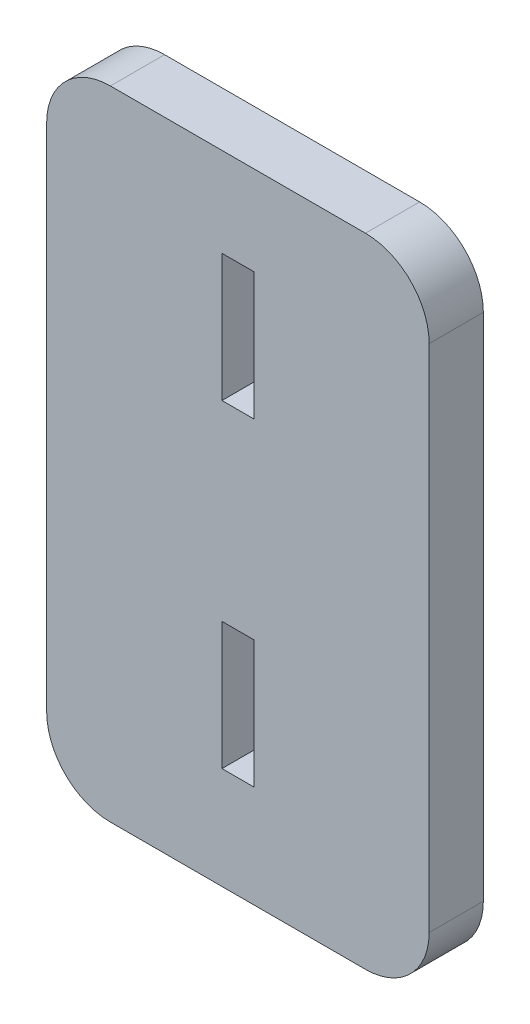
ISO-10303-21;
HEADER;
FILE_DESCRIPTION(('STEP AP214'),'2;1');
FILE_NAME('part.step','',(''),(''),'','','');
FILE_SCHEMA(('AUTOMOTIVE_DESIGN { 1 0 10303 214 1 1 1 1 }'));
ENDSEC;
DATA;
#1=APPLICATION_CONTEXT('core data for automotive mechanical design processes');
#2=APPLICATION_PROTOCOL_DEFINITION('international standard','automotive_design',2000,#1);
#3=PRODUCT_CONTEXT('',#1,'mechanical');
#4=PRODUCT('Part','Part','',(#3));
#5=PRODUCT_RELATED_PRODUCT_CATEGORY('part','',(#4));
#6=PRODUCT_DEFINITION_FORMATION('','',#4);
#7=PRODUCT_DEFINITION_CONTEXT('part definition',#1,'design');
#8=PRODUCT_DEFINITION('design','',#6,#7);
#9=PRODUCT_DEFINITION_SHAPE('','',#8);
#10=(LENGTH_UNIT() NAMED_UNIT(*) SI_UNIT(.MILLI.,.METRE.));
#11=(NAMED_UNIT(*) PLANE_ANGLE_UNIT() SI_UNIT($,.RADIAN.));
#12=(NAMED_UNIT(*) SI_UNIT($,.STERADIAN.) SOLID_ANGLE_UNIT());
#13=UNCERTAINTY_MEASURE_WITH_UNIT(LENGTH_MEASURE(1.E-05),#10,'distance_accuracy_value','');
#14=(GEOMETRIC_REPRESENTATION_CONTEXT(3) GLOBAL_UNCERTAINTY_ASSIGNED_CONTEXT((#13)) GLOBAL_UNIT_ASSIGNED_CONTEXT((#10,
#11,#12)) REPRESENTATION_CONTEXT('',''));
#15=CARTESIAN_POINT('',(0.,0.,0.));
#16=DIRECTION('',(0.,0.,1.));
#17=DIRECTION('',(1.,0.,0.));
#18=AXIS2_PLACEMENT_3D('',#15,#16,#17);
#19=CARTESIAN_POINT('',(30.,50.,8.5));
#20=DIRECTION('',(-1.,0.,0.));
#21=DIRECTION('',(0.,-1.,0.));
#22=AXIS2_PLACEMENT_3D('',#19,#20,#21);
#23=PLANE('',#22);
#24=DIRECTION('',(0.,1.,0.));
#25=VECTOR('',#24,1.);
#26=CARTESIAN_POINT('',(30.,50.,8.5));
#27=LINE('',#26,#25);
#28=CARTESIAN_POINT('',(30.,-40.,8.5));
#29=VERTEX_POINT('',#28);
#30=CARTESIAN_POINT('',(30.,40.,8.5));
#31=VERTEX_POINT('',#30);
#32=EDGE_CURVE('E259',#29,#31,#27,.T.);
#33=ORIENTED_EDGE('',*,*,#32,.F.);
#34=DIRECTION('',(0.,0.,-1.));
#35=VECTOR('',#34,1.);
#36=CARTESIAN_POINT('',(30.,-40.,8.5));
#37=LINE('',#36,#35);
#38=CARTESIAN_POINT('',(30.,-40.,0.));
#39=VERTEX_POINT('',#38);
#40=EDGE_CURVE('E303',#29,#39,#37,.T.);
#41=ORIENTED_EDGE('',*,*,#40,.T.);
#42=DIRECTION('',(0.,1.,0.));
#43=VECTOR('',#42,1.);
#44=CARTESIAN_POINT('',(30.,50.,0.));
#45=LINE('',#44,#43);
#46=CARTESIAN_POINT('',(30.,40.,0.));
#47=VERTEX_POINT('',#46);
#48=EDGE_CURVE('E210',#39,#47,#45,.T.);
#49=ORIENTED_EDGE('',*,*,#48,.T.);
#50=DIRECTION('',(0.,0.,-1.));
#51=VECTOR('',#50,1.);
#52=CARTESIAN_POINT('',(30.,40.,8.5));
#53=LINE('',#52,#51);
#54=EDGE_CURVE('E300',#47,#31,#53,.F.);
#55=ORIENTED_EDGE('',*,*,#54,.T.);
#56=EDGE_LOOP('',(#33,#41,#49,#55));
#57=FACE_BOUND('',#56,.T.);
#58=ADVANCED_FACE('F44',(#57),#23,.F.);
#59=CARTESIAN_POINT('',(-30.,50.,8.5));
#60=DIRECTION('',(0.,-1.,0.));
#61=DIRECTION('',(0.,0.,-1.));
#62=AXIS2_PLACEMENT_3D('',#59,#60,#61);
#63=PLANE('',#62);
#64=DIRECTION('',(-1.,0.,0.));
#65=VECTOR('',#64,1.);
#66=CARTESIAN_POINT('',(-30.,50.,8.5));
#67=LINE('',#66,#65);
#68=CARTESIAN_POINT('',(20.,50.,8.5));
#69=VERTEX_POINT('',#68);
#70=CARTESIAN_POINT('',(-20.,50.,8.5));
#71=VERTEX_POINT('',#70);
#72=EDGE_CURVE('E262',#69,#71,#67,.T.);
#73=ORIENTED_EDGE('',*,*,#72,.F.);
#74=DIRECTION('',(0.,0.,-1.));
#75=VECTOR('',#74,1.);
#76=CARTESIAN_POINT('',(20.,50.,8.5));
#77=LINE('',#76,#75);
#78=CARTESIAN_POINT('',(20.,50.,0.));
#79=VERTEX_POINT('',#78);
#80=EDGE_CURVE('E11',#69,#79,#77,.T.);
#81=ORIENTED_EDGE('',*,*,#80,.T.);
#82=DIRECTION('',(-1.,0.,0.));
#83=VECTOR('',#82,1.);
#84=CARTESIAN_POINT('',(-30.,50.,0.));
#85=LINE('',#84,#83);
#86=CARTESIAN_POINT('',(-20.,50.,0.));
#87=VERTEX_POINT('',#86);
#88=EDGE_CURVE('E277',#79,#87,#85,.T.);
#89=ORIENTED_EDGE('',*,*,#88,.T.);
#90=DIRECTION('',(0.,0.,-1.));
#91=VECTOR('',#90,1.);
#92=CARTESIAN_POINT('',(-20.,50.,8.5));
#93=LINE('',#92,#91);
#94=EDGE_CURVE('E293',#87,#71,#93,.F.);
#95=ORIENTED_EDGE('',*,*,#94,.T.);
#96=EDGE_LOOP('',(#73,#81,#89,#95));
#97=FACE_BOUND('',#96,.T.);
#98=ADVANCED_FACE('F360',(#97),#63,.F.);
#99=CARTESIAN_POINT('',(-30.,50.,8.5));
#100=DIRECTION('',(1.,0.,0.));
#101=DIRECTION('',(0.,0.,-1.));
#102=AXIS2_PLACEMENT_3D('',#99,#100,#101);
#103=PLANE('',#102);
#104=DIRECTION('',(0.,-1.,0.));
#105=VECTOR('',#104,1.);
#106=CARTESIAN_POINT('',(-30.,50.,0.));
#107=LINE('',#106,#105);
#108=CARTESIAN_POINT('',(-30.,40.,0.));
#109=VERTEX_POINT('',#108);
#110=CARTESIAN_POINT('',(-30.,-40.,0.));
#111=VERTEX_POINT('',#110);
#112=EDGE_CURVE('E280',#109,#111,#107,.T.);
#113=ORIENTED_EDGE('',*,*,#112,.T.);
#114=DIRECTION('',(0.,0.,-1.));
#115=VECTOR('',#114,1.);
#116=CARTESIAN_POINT('',(-30.,-40.,8.5));
#117=LINE('',#116,#115);
#118=CARTESIAN_POINT('',(-30.,-40.,8.5));
#119=VERTEX_POINT('',#118);
#120=EDGE_CURVE('E53',#111,#119,#117,.F.);
#121=ORIENTED_EDGE('',*,*,#120,.T.);
#122=DIRECTION('',(0.,-1.,0.));
#123=VECTOR('',#122,1.);
#124=CARTESIAN_POINT('',(-30.,50.,8.5));
#125=LINE('',#124,#123);
#126=CARTESIAN_POINT('',(-30.,40.,8.5));
#127=VERTEX_POINT('',#126);
#128=EDGE_CURVE('E266',#127,#119,#125,.T.);
#129=ORIENTED_EDGE('',*,*,#128,.F.);
#130=DIRECTION('',(0.,0.,-1.));
#131=VECTOR('',#130,1.);
#132=CARTESIAN_POINT('',(-30.,40.,8.5));
#133=LINE('',#132,#131);
#134=EDGE_CURVE('E273',#127,#109,#133,.T.);
#135=ORIENTED_EDGE('',*,*,#134,.T.);
#136=EDGE_LOOP('',(#113,#121,#129,#135));
#137=FACE_BOUND('',#136,.T.);
#138=ADVANCED_FACE('F352',(#137),#103,.F.);
#139=CARTESIAN_POINT('',(-30.,-50.,8.5));
#140=DIRECTION('',(0.,1.,0.));
#141=DIRECTION('',(-1.,0.,0.));
#142=AXIS2_PLACEMENT_3D('',#139,#140,#141);
#143=PLANE('',#142);
#144=DIRECTION('',(1.,0.,0.));
#145=VECTOR('',#144,1.);
#146=CARTESIAN_POINT('',(-30.,-50.,0.));
#147=LINE('',#146,#145);
#148=CARTESIAN_POINT('',(-20.,-50.,0.));
#149=VERTEX_POINT('',#148);
#150=CARTESIAN_POINT('',(20.,-50.,0.));
#151=VERTEX_POINT('',#150);
#152=EDGE_CURVE('E263',#149,#151,#147,.T.);
#153=ORIENTED_EDGE('',*,*,#152,.T.);
#154=DIRECTION('',(0.,0.,-1.));
#155=VECTOR('',#154,1.);
#156=CARTESIAN_POINT('',(20.,-50.,8.5));
#157=LINE('',#156,#155);
#158=CARTESIAN_POINT('',(20.,-50.,8.5));
#159=VERTEX_POINT('',#158);
#160=EDGE_CURVE('E320',#151,#159,#157,.F.);
#161=ORIENTED_EDGE('',*,*,#160,.T.);
#162=DIRECTION('',(1.,0.,0.));
#163=VECTOR('',#162,1.);
#164=CARTESIAN_POINT('',(-30.,-50.,8.5));
#165=LINE('',#164,#163);
#166=CARTESIAN_POINT('',(-20.,-50.,8.5));
#167=VERTEX_POINT('',#166);
#168=EDGE_CURVE('E269',#167,#159,#165,.T.);
#169=ORIENTED_EDGE('',*,*,#168,.F.);
#170=DIRECTION('',(0.,0.,-1.));
#171=VECTOR('',#170,1.);
#172=CARTESIAN_POINT('',(-20.,-50.,8.5));
#173=LINE('',#172,#171);
#174=EDGE_CURVE('E316',#167,#149,#173,.T.);
#175=ORIENTED_EDGE('',*,*,#174,.T.);
#176=EDGE_LOOP('',(#153,#161,#169,#175));
#177=FACE_BOUND('',#176,.T.);
#178=ADVANCED_FACE('F346',(#177),#143,.F.);
#179=CARTESIAN_POINT('',(0.,0.,8.5));
#180=DIRECTION('',(0.,0.,1.));
#181=DIRECTION('',(1.,0.,0.));
#182=AXIS2_PLACEMENT_3D('',#179,#180,#181);
#183=PLANE('',#182);
#184=DIRECTION('',(0.,1.,0.));
#185=VECTOR('',#184,1.);
#186=CARTESIAN_POINT('',(2.5,36.02,8.5));
#187=LINE('',#186,#185);
#188=CARTESIAN_POINT('',(2.5,16.02,8.5));
#189=VERTEX_POINT('',#188);
#190=CARTESIAN_POINT('',(2.5,36.02,8.5));
#191=VERTEX_POINT('',#190);
#192=EDGE_CURVE('E167',#189,#191,#187,.T.);
#193=ORIENTED_EDGE('',*,*,#192,.F.);
#194=DIRECTION('',(1.,0.,0.));
#195=VECTOR('',#194,1.);
#196=CARTESIAN_POINT('',(-2.5,16.02,8.5));
#197=LINE('',#196,#195);
#198=CARTESIAN_POINT('',(-2.5,16.02,8.5));
#199=VERTEX_POINT('',#198);
#200=EDGE_CURVE('E187',#199,#189,#197,.T.);
#201=ORIENTED_EDGE('',*,*,#200,.F.);
#202=DIRECTION('',(0.,-1.,0.));
#203=VECTOR('',#202,1.);
#204=CARTESIAN_POINT('',(-2.5,36.02,8.5));
#205=LINE('',#204,#203);
#206=CARTESIAN_POINT('',(-2.5,36.02,8.5));
#207=VERTEX_POINT('',#206);
#208=EDGE_CURVE('E191',#207,#199,#205,.T.);
#209=ORIENTED_EDGE('',*,*,#208,.F.);
#210=DIRECTION('',(-1.,0.,0.));
#211=VECTOR('',#210,1.);
#212=CARTESIAN_POINT('',(-2.5,36.02,8.5));
#213=LINE('',#212,#211);
#214=EDGE_CURVE('E200',#191,#207,#213,.T.);
#215=ORIENTED_EDGE('',*,*,#214,.F.);
#216=EDGE_LOOP('',(#193,#201,#209,#215));
#217=FACE_BOUND('',#216,.T.);
#218=DIRECTION('',(0.,1.,0.));
#219=VECTOR('',#218,1.);
#220=CARTESIAN_POINT('',(2.5,-13.9800000000001,8.5));
#221=LINE('',#220,#219);
#222=CARTESIAN_POINT('',(2.5,-33.9800000000001,8.5));
#223=VERTEX_POINT('',#222);
#224=CARTESIAN_POINT('',(2.5,-13.9800000000001,8.5));
#225=VERTEX_POINT('',#224);
#226=EDGE_CURVE('E201',#223,#225,#221,.T.);
#227=ORIENTED_EDGE('',*,*,#226,.F.);
#228=DIRECTION('',(1.,0.,0.));
#229=VECTOR('',#228,1.);
#230=CARTESIAN_POINT('',(-2.5,-33.9800000000001,8.5));
#231=LINE('',#230,#229);
#232=CARTESIAN_POINT('',(-2.5,-33.9800000000001,8.5));
#233=VERTEX_POINT('',#232);
#234=EDGE_CURVE('E230',#233,#223,#231,.T.);
#235=ORIENTED_EDGE('',*,*,#234,.F.);
#236=DIRECTION('',(0.,-1.,0.));
#237=VECTOR('',#236,1.);
#238=CARTESIAN_POINT('',(-2.5,-13.9800000000001,8.5));
#239=LINE('',#238,#237);
#240=CARTESIAN_POINT('',(-2.5,-13.9800000000001,8.5));
#241=VERTEX_POINT('',#240);
#242=EDGE_CURVE('E234',#241,#233,#239,.T.);
#243=ORIENTED_EDGE('',*,*,#242,.F.);
#244=DIRECTION('',(-1.,0.,0.));
#245=VECTOR('',#244,1.);
#246=CARTESIAN_POINT('',(-2.5,-13.9800000000001,8.5));
#247=LINE('',#246,#245);
#248=EDGE_CURVE('E239',#225,#241,#247,.T.);
#249=ORIENTED_EDGE('',*,*,#248,.F.);
#250=EDGE_LOOP('',(#227,#235,#243,#249));
#251=FACE_BOUND('',#250,.T.);
#252=ORIENTED_EDGE('',*,*,#168,.T.);
#253=CARTESIAN_POINT('',(20.,-40.,8.5));
#254=DIRECTION('',(0.,0.,1.));
#255=DIRECTION('',(1.,0.,0.));
#256=AXIS2_PLACEMENT_3D('',#253,#254,#255);
#257=CIRCLE('',#256,10.);
#258=EDGE_CURVE('E328',#159,#29,#257,.T.);
#259=ORIENTED_EDGE('',*,*,#258,.T.);
#260=ORIENTED_EDGE('',*,*,#32,.T.);
#261=CARTESIAN_POINT('',(20.,40.,8.5));
#262=DIRECTION('',(0.,0.,1.));
#263=DIRECTION('',(1.,0.,0.));
#264=AXIS2_PLACEMENT_3D('',#261,#262,#263);
#265=CIRCLE('',#264,10.);
#266=EDGE_CURVE('E67',#31,#69,#265,.T.);
#267=ORIENTED_EDGE('',*,*,#266,.T.);
#268=ORIENTED_EDGE('',*,*,#72,.T.);
#269=CARTESIAN_POINT('',(-20.,40.,8.5));
#270=DIRECTION('',(0.,0.,1.));
#271=DIRECTION('',(1.,0.,0.));
#272=AXIS2_PLACEMENT_3D('',#269,#270,#271);
#273=CIRCLE('',#272,10.);
#274=EDGE_CURVE('E297',#71,#127,#273,.T.);
#275=ORIENTED_EDGE('',*,*,#274,.T.);
#276=ORIENTED_EDGE('',*,*,#128,.T.);
#277=CARTESIAN_POINT('',(-20.,-40.,8.5));
#278=DIRECTION('',(0.,0.,1.));
#279=DIRECTION('',(1.,0.,0.));
#280=AXIS2_PLACEMENT_3D('',#277,#278,#279);
#281=CIRCLE('',#280,10.);
#282=EDGE_CURVE('E325',#119,#167,#281,.T.);
#283=ORIENTED_EDGE('',*,*,#282,.T.);
#284=EDGE_LOOP('',(#252,#259,#260,#267,#268,#275,#276,#283));
#285=FACE_BOUND('',#284,.T.);
#286=ADVANCED_FACE('F333',(#217,#251,#285),#183,.T.);
#287=CARTESIAN_POINT('',(0.,0.,0.));
#288=DIRECTION('',(0.,0.,1.));
#289=DIRECTION('',(1.,0.,0.));
#290=AXIS2_PLACEMENT_3D('',#287,#288,#289);
#291=PLANE('',#290);
#292=ORIENTED_EDGE('',*,*,#48,.F.);
#293=CARTESIAN_POINT('',(20.,-40.,0.));
#294=DIRECTION('',(0.,0.,1.));
#295=DIRECTION('',(1.,0.,0.));
#296=AXIS2_PLACEMENT_3D('',#293,#294,#295);
#297=CIRCLE('',#296,10.);
#298=EDGE_CURVE('E313',#39,#151,#297,.F.);
#299=ORIENTED_EDGE('',*,*,#298,.T.);
#300=ORIENTED_EDGE('',*,*,#152,.F.);
#301=CARTESIAN_POINT('',(-20.,-40.,0.));
#302=DIRECTION('',(0.,0.,1.));
#303=DIRECTION('',(1.,0.,0.));
#304=AXIS2_PLACEMENT_3D('',#301,#302,#303);
#305=CIRCLE('',#304,10.);
#306=EDGE_CURVE('E310',#149,#111,#305,.F.);
#307=ORIENTED_EDGE('',*,*,#306,.T.);
#308=ORIENTED_EDGE('',*,*,#112,.F.);
#309=CARTESIAN_POINT('',(-20.,40.,0.));
#310=DIRECTION('',(0.,0.,1.));
#311=DIRECTION('',(1.,0.,0.));
#312=AXIS2_PLACEMENT_3D('',#309,#310,#311);
#313=CIRCLE('',#312,10.);
#314=EDGE_CURVE('E289',#109,#87,#313,.F.);
#315=ORIENTED_EDGE('',*,*,#314,.T.);
#316=ORIENTED_EDGE('',*,*,#88,.F.);
#317=CARTESIAN_POINT('',(20.,40.,0.));
#318=DIRECTION('',(0.,0.,1.));
#319=DIRECTION('',(1.,0.,0.));
#320=AXIS2_PLACEMENT_3D('',#317,#318,#319);
#321=CIRCLE('',#320,10.);
#322=EDGE_CURVE('E307',#79,#47,#321,.F.);
#323=ORIENTED_EDGE('',*,*,#322,.T.);
#324=EDGE_LOOP('',(#292,#299,#300,#307,#308,#315,#316,#323));
#325=FACE_BOUND('',#324,.T.);
#326=ADVANCED_FACE('F344',(#325),#291,.F.);
#327=CARTESIAN_POINT('',(2.5,-13.9800000000001,1.02));
#328=DIRECTION('',(1.,0.,0.));
#329=DIRECTION('',(0.,1.,0.));
#330=AXIS2_PLACEMENT_3D('',#327,#328,#329);
#331=PLANE('',#330);
#332=ORIENTED_EDGE('',*,*,#226,.T.);
#333=DIRECTION('',(0.,0.,1.));
#334=VECTOR('',#333,1.);
#335=CARTESIAN_POINT('',(2.5,-13.9800000000001,1.02));
#336=LINE('',#335,#334);
#337=CARTESIAN_POINT('',(2.5,-13.9800000000001,1.02));
#338=VERTEX_POINT('',#337);
#339=EDGE_CURVE('E216',#338,#225,#336,.T.);
#340=ORIENTED_EDGE('',*,*,#339,.F.);
#341=DIRECTION('',(0.,1.,0.));
#342=VECTOR('',#341,1.);
#343=CARTESIAN_POINT('',(2.5,-13.9800000000001,1.02));
#344=LINE('',#343,#342);
#345=CARTESIAN_POINT('',(2.5,-33.9800000000001,1.02));
#346=VERTEX_POINT('',#345);
#347=EDGE_CURVE('E235',#346,#338,#344,.T.);
#348=ORIENTED_EDGE('',*,*,#347,.F.);
#349=DIRECTION('',(0.,0.,1.));
#350=VECTOR('',#349,1.);
#351=CARTESIAN_POINT('',(2.5,-33.9800000000001,1.02));
#352=LINE('',#351,#350);
#353=EDGE_CURVE('E227',#346,#223,#352,.T.);
#354=ORIENTED_EDGE('',*,*,#353,.T.);
#355=EDGE_LOOP('',(#332,#340,#348,#354));
#356=FACE_BOUND('',#355,.T.);
#357=ADVANCED_FACE('F488',(#356),#331,.F.);
#358=CARTESIAN_POINT('',(-2.5,-33.9800000000001,1.02));
#359=DIRECTION('',(0.,-1.,0.));
#360=DIRECTION('',(0.,0.,-1.));
#361=AXIS2_PLACEMENT_3D('',#358,#359,#360);
#362=PLANE('',#361);
#363=ORIENTED_EDGE('',*,*,#234,.T.);
#364=ORIENTED_EDGE('',*,*,#353,.F.);
#365=DIRECTION('',(1.,0.,0.));
#366=VECTOR('',#365,1.);
#367=CARTESIAN_POINT('',(-2.5,-33.9800000000001,1.02));
#368=LINE('',#367,#366);
#369=CARTESIAN_POINT('',(-2.5,-33.9800000000001,1.02));
#370=VERTEX_POINT('',#369);
#371=EDGE_CURVE('E220',#370,#346,#368,.T.);
#372=ORIENTED_EDGE('',*,*,#371,.F.);
#373=DIRECTION('',(0.,0.,1.));
#374=VECTOR('',#373,1.);
#375=CARTESIAN_POINT('',(-2.5,-33.9800000000001,1.02));
#376=LINE('',#375,#374);
#377=EDGE_CURVE('E224',#370,#233,#376,.T.);
#378=ORIENTED_EDGE('',*,*,#377,.T.);
#379=EDGE_LOOP('',(#363,#364,#372,#378));
#380=FACE_BOUND('',#379,.T.);
#381=ADVANCED_FACE('F478',(#380),#362,.F.);
#382=CARTESIAN_POINT('',(-2.5,-13.9800000000001,1.02));
#383=DIRECTION('',(-1.,0.,0.));
#384=DIRECTION('',(0.,-1.,0.));
#385=AXIS2_PLACEMENT_3D('',#382,#383,#384);
#386=PLANE('',#385);
#387=ORIENTED_EDGE('',*,*,#242,.T.);
#388=ORIENTED_EDGE('',*,*,#377,.F.);
#389=DIRECTION('',(0.,-1.,0.));
#390=VECTOR('',#389,1.);
#391=CARTESIAN_POINT('',(-2.5,-13.9800000000001,1.02));
#392=LINE('',#391,#390);
#393=CARTESIAN_POINT('',(-2.5,-13.9800000000001,1.02));
#394=VERTEX_POINT('',#393);
#395=EDGE_CURVE('E248',#394,#370,#392,.T.);
#396=ORIENTED_EDGE('',*,*,#395,.F.);
#397=DIRECTION('',(0.,0.,1.));
#398=VECTOR('',#397,1.);
#399=CARTESIAN_POINT('',(-2.5,-13.9800000000001,1.02));
#400=LINE('',#399,#398);
#401=EDGE_CURVE('E221',#394,#241,#400,.T.);
#402=ORIENTED_EDGE('',*,*,#401,.T.);
#403=EDGE_LOOP('',(#387,#388,#396,#402));
#404=FACE_BOUND('',#403,.T.);
#405=ADVANCED_FACE('F468',(#404),#386,.F.);
#406=CARTESIAN_POINT('',(-2.5,-13.9800000000001,1.02));
#407=DIRECTION('',(0.,1.,0.));
#408=DIRECTION('',(0.,0.,1.));
#409=AXIS2_PLACEMENT_3D('',#406,#407,#408);
#410=PLANE('',#409);
#411=ORIENTED_EDGE('',*,*,#248,.T.);
#412=ORIENTED_EDGE('',*,*,#401,.F.);
#413=DIRECTION('',(-1.,0.,0.));
#414=VECTOR('',#413,1.);
#415=CARTESIAN_POINT('',(-2.5,-13.9800000000001,1.02));
#416=LINE('',#415,#414);
#417=EDGE_CURVE('E252',#338,#394,#416,.T.);
#418=ORIENTED_EDGE('',*,*,#417,.F.);
#419=ORIENTED_EDGE('',*,*,#339,.T.);
#420=EDGE_LOOP('',(#411,#412,#418,#419));
#421=FACE_BOUND('',#420,.T.);
#422=ADVANCED_FACE('F458',(#421),#410,.F.);
#423=CARTESIAN_POINT('',(0.,0.,1.02));
#424=DIRECTION('',(0.,0.,1.));
#425=DIRECTION('',(1.,0.,0.));
#426=AXIS2_PLACEMENT_3D('',#423,#424,#425);
#427=PLANE('',#426);
#428=ORIENTED_EDGE('',*,*,#347,.T.);
#429=ORIENTED_EDGE('',*,*,#417,.T.);
#430=ORIENTED_EDGE('',*,*,#395,.T.);
#431=ORIENTED_EDGE('',*,*,#371,.T.);
#432=EDGE_LOOP('',(#428,#429,#430,#431));
#433=FACE_BOUND('',#432,.T.);
#434=ADVANCED_FACE('F449',(#433),#427,.T.);
#435=CARTESIAN_POINT('',(2.5,36.02,1.02));
#436=DIRECTION('',(1.,0.,0.));
#437=DIRECTION('',(0.,1.,0.));
#438=AXIS2_PLACEMENT_3D('',#435,#436,#437);
#439=PLANE('',#438);
#440=ORIENTED_EDGE('',*,*,#192,.T.);
#441=DIRECTION('',(0.,0.,1.));
#442=VECTOR('',#441,1.);
#443=CARTESIAN_POINT('',(2.5,36.02,1.02));
#444=LINE('',#443,#442);
#445=CARTESIAN_POINT('',(2.5,36.02,1.02));
#446=VERTEX_POINT('',#445);
#447=EDGE_CURVE('E160',#446,#191,#444,.T.);
#448=ORIENTED_EDGE('',*,*,#447,.F.);
#449=DIRECTION('',(0.,1.,0.));
#450=VECTOR('',#449,1.);
#451=CARTESIAN_POINT('',(2.5,36.02,1.02));
#452=LINE('',#451,#450);
#453=CARTESIAN_POINT('',(2.5,16.02,1.02));
#454=VERTEX_POINT('',#453);
#455=EDGE_CURVE('E164',#454,#446,#452,.T.);
#456=ORIENTED_EDGE('',*,*,#455,.F.);
#457=DIRECTION('',(0.,0.,1.));
#458=VECTOR('',#457,1.);
#459=CARTESIAN_POINT('',(2.5,16.02,1.02));
#460=LINE('',#459,#458);
#461=EDGE_CURVE('E207',#454,#189,#460,.T.);
#462=ORIENTED_EDGE('',*,*,#461,.T.);
#463=EDGE_LOOP('',(#440,#448,#456,#462));
#464=FACE_BOUND('',#463,.T.);
#465=ADVANCED_FACE('F162',(#464),#439,.F.);
#466=CARTESIAN_POINT('',(-2.5,16.02,1.02));
#467=DIRECTION('',(0.,-1.,0.));
#468=DIRECTION('',(0.,0.,-1.));
#469=AXIS2_PLACEMENT_3D('',#466,#467,#468);
#470=PLANE('',#469);
#471=ORIENTED_EDGE('',*,*,#200,.T.);
#472=ORIENTED_EDGE('',*,*,#461,.F.);
#473=DIRECTION('',(1.,0.,0.));
#474=VECTOR('',#473,1.);
#475=CARTESIAN_POINT('',(-2.5,16.02,1.02));
#476=LINE('',#475,#474);
#477=CARTESIAN_POINT('',(-2.5,16.02,1.02));
#478=VERTEX_POINT('',#477);
#479=EDGE_CURVE('E173',#478,#454,#476,.T.);
#480=ORIENTED_EDGE('',*,*,#479,.F.);
#481=DIRECTION('',(0.,0.,1.));
#482=VECTOR('',#481,1.);
#483=CARTESIAN_POINT('',(-2.5,16.02,1.02));
#484=LINE('',#483,#482);
#485=EDGE_CURVE('E211',#478,#199,#484,.T.);
#486=ORIENTED_EDGE('',*,*,#485,.T.);
#487=EDGE_LOOP('',(#471,#472,#480,#486));
#488=FACE_BOUND('',#487,.T.);
#489=ADVANCED_FACE('F430',(#488),#470,.F.);
#490=CARTESIAN_POINT('',(-2.5,36.02,1.02));
#491=DIRECTION('',(-1.,0.,0.));
#492=DIRECTION('',(0.,-1.,0.));
#493=AXIS2_PLACEMENT_3D('',#490,#491,#492);
#494=PLANE('',#493);
#495=ORIENTED_EDGE('',*,*,#208,.T.);
#496=ORIENTED_EDGE('',*,*,#485,.F.);
#497=DIRECTION('',(0.,-1.,0.));
#498=VECTOR('',#497,1.);
#499=CARTESIAN_POINT('',(-2.5,36.02,1.02));
#500=LINE('',#499,#498);
#501=CARTESIAN_POINT('',(-2.5,36.02,1.02));
#502=VERTEX_POINT('',#501);
#503=EDGE_CURVE('E182',#502,#478,#500,.T.);
#504=ORIENTED_EDGE('',*,*,#503,.F.);
#505=DIRECTION('',(0.,0.,1.));
#506=VECTOR('',#505,1.);
#507=CARTESIAN_POINT('',(-2.5,36.02,1.02));
#508=LINE('',#507,#506);
#509=EDGE_CURVE('E172',#502,#207,#508,.T.);
#510=ORIENTED_EDGE('',*,*,#509,.T.);
#511=EDGE_LOOP('',(#495,#496,#504,#510));
#512=FACE_BOUND('',#511,.T.);
#513=ADVANCED_FACE('F421',(#512),#494,.F.);
#514=CARTESIAN_POINT('',(-2.5,36.02,1.02));
#515=DIRECTION('',(0.,1.,0.));
#516=DIRECTION('',(0.,0.,1.));
#517=AXIS2_PLACEMENT_3D('',#514,#515,#516);
#518=PLANE('',#517);
#519=ORIENTED_EDGE('',*,*,#214,.T.);
#520=ORIENTED_EDGE('',*,*,#509,.F.);
#521=DIRECTION('',(-1.,0.,0.));
#522=VECTOR('',#521,1.);
#523=CARTESIAN_POINT('',(-2.5,36.02,1.02));
#524=LINE('',#523,#522);
#525=EDGE_CURVE('E176',#446,#502,#524,.T.);
#526=ORIENTED_EDGE('',*,*,#525,.F.);
#527=ORIENTED_EDGE('',*,*,#447,.T.);
#528=EDGE_LOOP('',(#519,#520,#526,#527));
#529=FACE_BOUND('',#528,.T.);
#530=ADVANCED_FACE('F177',(#529),#518,.F.);
#531=CARTESIAN_POINT('',(0.,0.,1.02));
#532=DIRECTION('',(0.,0.,1.));
#533=DIRECTION('',(1.,0.,0.));
#534=AXIS2_PLACEMENT_3D('',#531,#532,#533);
#535=PLANE('',#534);
#536=ORIENTED_EDGE('',*,*,#455,.T.);
#537=ORIENTED_EDGE('',*,*,#525,.T.);
#538=ORIENTED_EDGE('',*,*,#503,.T.);
#539=ORIENTED_EDGE('',*,*,#479,.T.);
#540=EDGE_LOOP('',(#536,#537,#538,#539));
#541=FACE_BOUND('',#540,.T.);
#542=ADVANCED_FACE('F184',(#541),#535,.T.);
#543=CARTESIAN_POINT('',(-20.,40.,8.5));
#544=DIRECTION('',(0.,0.,-1.));
#545=DIRECTION('',(-1.,0.,0.));
#546=AXIS2_PLACEMENT_3D('',#543,#544,#545);
#547=CYLINDRICAL_SURFACE('',#546,10.);
#548=ORIENTED_EDGE('',*,*,#274,.F.);
#549=ORIENTED_EDGE('',*,*,#94,.F.);
#550=ORIENTED_EDGE('',*,*,#314,.F.);
#551=ORIENTED_EDGE('',*,*,#134,.F.);
#552=EDGE_LOOP('',(#548,#549,#550,#551));
#553=FACE_BOUND('',#552,.T.);
#554=ADVANCED_FACE('F356',(#553),#547,.T.);
#555=CARTESIAN_POINT('',(20.,-40.,8.5));
#556=DIRECTION('',(0.,0.,-1.));
#557=DIRECTION('',(-1.,0.,0.));
#558=AXIS2_PLACEMENT_3D('',#555,#556,#557);
#559=CYLINDRICAL_SURFACE('',#558,10.);
#560=ORIENTED_EDGE('',*,*,#258,.F.);
#561=ORIENTED_EDGE('',*,*,#160,.F.);
#562=ORIENTED_EDGE('',*,*,#298,.F.);
#563=ORIENTED_EDGE('',*,*,#40,.F.);
#564=EDGE_LOOP('',(#560,#561,#562,#563));
#565=FACE_BOUND('',#564,.T.);
#566=ADVANCED_FACE('F341',(#565),#559,.T.);
#567=CARTESIAN_POINT('',(-20.,-40.,8.5));
#568=DIRECTION('',(0.,0.,-1.));
#569=DIRECTION('',(-1.,0.,0.));
#570=AXIS2_PLACEMENT_3D('',#567,#568,#569);
#571=CYLINDRICAL_SURFACE('',#570,10.);
#572=ORIENTED_EDGE('',*,*,#282,.F.);
#573=ORIENTED_EDGE('',*,*,#120,.F.);
#574=ORIENTED_EDGE('',*,*,#306,.F.);
#575=ORIENTED_EDGE('',*,*,#174,.F.);
#576=EDGE_LOOP('',(#572,#573,#574,#575));
#577=FACE_BOUND('',#576,.T.);
#578=ADVANCED_FACE('F350',(#577),#571,.T.);
#579=CARTESIAN_POINT('',(20.,40.,8.5));
#580=DIRECTION('',(0.,0.,-1.));
#581=DIRECTION('',(-1.,0.,0.));
#582=AXIS2_PLACEMENT_3D('',#579,#580,#581);
#583=CYLINDRICAL_SURFACE('',#582,10.);
#584=ORIENTED_EDGE('',*,*,#266,.F.);
#585=ORIENTED_EDGE('',*,*,#54,.F.);
#586=ORIENTED_EDGE('',*,*,#322,.F.);
#587=ORIENTED_EDGE('',*,*,#80,.F.);
#588=EDGE_LOOP('',(#584,#585,#586,#587));
#589=FACE_BOUND('',#588,.T.);
#590=ADVANCED_FACE('F46',(#589),#583,.T.);
#591=CLOSED_SHELL('',(#58,#98,#138,#178,#286,#326,#357,#381,#405,#422,#434,#465,#489,#513,#530,
#542,#554,#566,#578,#590));
#592=MANIFOLD_SOLID_BREP('B2',#591);
#593=ADVANCED_BREP_SHAPE_REPRESENTATION('',(#18,#592),#14);
#594=SHAPE_DEFINITION_REPRESENTATION(#9,#593);
ENDSEC;
END-ISO-10303-21;
